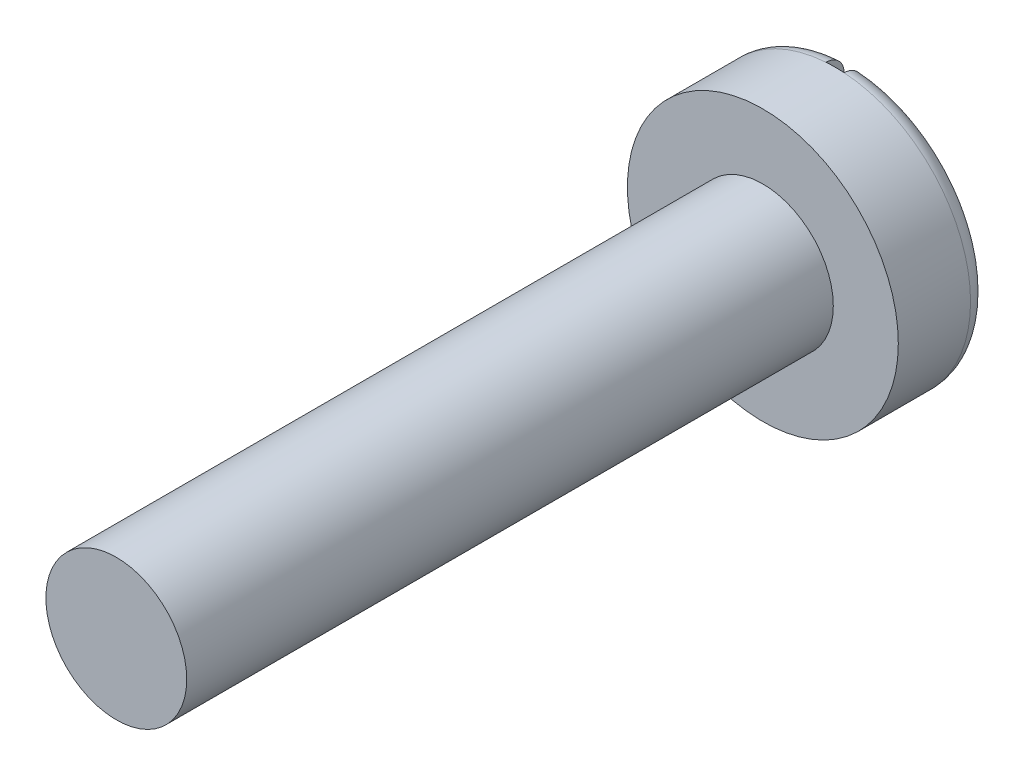
ISO-10303-21;
HEADER;
FILE_DESCRIPTION(('STEP AP214'),'2;1');
FILE_NAME('part.step','',(''),(''),'','','');
FILE_SCHEMA(('AUTOMOTIVE_DESIGN { 1 0 10303 214 1 1 1 1 }'));
ENDSEC;
DATA;
#1=APPLICATION_CONTEXT('core data for automotive mechanical design processes');
#2=APPLICATION_PROTOCOL_DEFINITION('international standard','automotive_design',2000,#1);
#3=PRODUCT_CONTEXT('',#1,'mechanical');
#4=PRODUCT('Part','Part','',(#3));
#5=PRODUCT_RELATED_PRODUCT_CATEGORY('part','',(#4));
#6=PRODUCT_DEFINITION_FORMATION('','',#4);
#7=PRODUCT_DEFINITION_CONTEXT('part definition',#1,'design');
#8=PRODUCT_DEFINITION('design','',#6,#7);
#9=PRODUCT_DEFINITION_SHAPE('','',#8);
#10=(LENGTH_UNIT() NAMED_UNIT(*) SI_UNIT(.MILLI.,.METRE.));
#11=(NAMED_UNIT(*) PLANE_ANGLE_UNIT() SI_UNIT($,.RADIAN.));
#12=(NAMED_UNIT(*) SI_UNIT($,.STERADIAN.) SOLID_ANGLE_UNIT());
#13=UNCERTAINTY_MEASURE_WITH_UNIT(LENGTH_MEASURE(1.E-05),#10,'distance_accuracy_value','');
#14=(GEOMETRIC_REPRESENTATION_CONTEXT(3) GLOBAL_UNCERTAINTY_ASSIGNED_CONTEXT((#13)) GLOBAL_UNIT_ASSIGNED_CONTEXT((#10,
#11,#12)) REPRESENTATION_CONTEXT('',''));
#15=CARTESIAN_POINT('',(0.,0.,0.));
#16=DIRECTION('',(0.,0.,1.));
#17=DIRECTION('',(1.,0.,0.));
#18=AXIS2_PLACEMENT_3D('',#15,#16,#17);
#19=CARTESIAN_POINT('',(0.,0.,55.));
#20=DIRECTION('',(0.,0.,1.));
#21=DIRECTION('',(1.,0.,0.));
#22=AXIS2_PLACEMENT_3D('',#19,#20,#21);
#23=CYLINDRICAL_SURFACE('',#22,1.905);
#24=CARTESIAN_POINT('',(0.,0.,0.));
#25=DIRECTION('',(0.,0.,1.));
#26=DIRECTION('',(1.,0.,0.));
#27=AXIS2_PLACEMENT_3D('',#24,#25,#26);
#28=CIRCLE('',#27,1.905);
#29=CARTESIAN_POINT('',(1.905,0.,0.));
#30=VERTEX_POINT('',#29);
#31=EDGE_CURVE('E104',#30,#30,#28,.T.);
#32=ORIENTED_EDGE('',*,*,#31,.F.);
#33=EDGE_LOOP('',(#32));
#34=FACE_BOUND('',#33,.T.);
#35=CARTESIAN_POINT('',(0.,0.,-1.016));
#36=DIRECTION('',(0.,0.,-1.));
#37=DIRECTION('',(-1.,0.,0.));
#38=AXIS2_PLACEMENT_3D('',#35,#36,#37);
#39=CIRCLE('',#38,1.905);
#40=CARTESIAN_POINT('',(-0.127,1.90076195248116,-1.016));
#41=VERTEX_POINT('',#40);
#42=CARTESIAN_POINT('',(0.127,1.90076195248116,-1.016));
#43=VERTEX_POINT('',#42);
#44=EDGE_CURVE('E83',#41,#43,#39,.T.);
#45=ORIENTED_EDGE('',*,*,#44,.F.);
#46=CARTESIAN_POINT('',(0.,0.,-1.016));
#47=DIRECTION('',(0.,0.,1.));
#48=DIRECTION('',(1.,0.,0.));
#49=AXIS2_PLACEMENT_3D('',#46,#47,#48);
#50=CIRCLE('',#49,1.905);
#51=CARTESIAN_POINT('',(-0.127,-1.90076195248116,-1.016));
#52=VERTEX_POINT('',#51);
#53=EDGE_CURVE('E87',#41,#52,#50,.T.);
#54=ORIENTED_EDGE('',*,*,#53,.T.);
#55=CARTESIAN_POINT('',(0.127,-1.90076195248116,-1.016));
#56=VERTEX_POINT('',#55);
#57=EDGE_CURVE('E86',#56,#52,#39,.T.);
#58=ORIENTED_EDGE('',*,*,#57,.F.);
#59=CARTESIAN_POINT('',(0.,0.,-1.016));
#60=DIRECTION('',(0.,0.,1.));
#61=DIRECTION('',(1.,0.,0.));
#62=AXIS2_PLACEMENT_3D('',#59,#60,#61);
#63=CIRCLE('',#62,1.905);
#64=EDGE_CURVE('E76',#56,#43,#63,.T.);
#65=ORIENTED_EDGE('',*,*,#64,.T.);
#66=EDGE_LOOP('',(#45,#54,#58,#65));
#67=FACE_BOUND('',#66,.T.);
#68=ADVANCED_FACE('F36',(#34,#67),#23,.T.);
#69=CARTESIAN_POINT('',(0.,1.905,-1.27));
#70=DIRECTION('',(0.,0.,1.));
#71=DIRECTION('',(1.,0.,0.));
#72=AXIS2_PLACEMENT_3D('',#69,#70,#71);
#73=PLANE('',#72);
#74=DIRECTION('',(0.,-1.,0.));
#75=VECTOR('',#74,1.);
#76=CARTESIAN_POINT('',(-0.127,0.,-1.27));
#77=LINE('',#76,#75);
#78=CARTESIAN_POINT('',(-0.127,1.6461081373956,-1.27));
#79=VERTEX_POINT('',#78);
#80=CARTESIAN_POINT('',(-0.127,-1.6461081373956,-1.27));
#81=VERTEX_POINT('',#80);
#82=EDGE_CURVE('E99',#79,#81,#77,.T.);
#83=ORIENTED_EDGE('',*,*,#82,.T.);
#84=CARTESIAN_POINT('',(0.,0.,-1.27));
#85=DIRECTION('',(0.,0.,1.));
#86=DIRECTION('',(1.,0.,0.));
#87=AXIS2_PLACEMENT_3D('',#84,#85,#86);
#88=CIRCLE('',#87,1.651);
#89=EDGE_CURVE('E170',#81,#79,#88,.F.);
#90=ORIENTED_EDGE('',*,*,#89,.T.);
#91=EDGE_LOOP('',(#83,#90));
#92=FACE_BOUND('',#91,.T.);
#93=ADVANCED_FACE('F144',(#92),#73,.F.);
#94=CARTESIAN_POINT('',(0.,0.990599999999999,9.0932));
#95=DIRECTION('',(0.,0.,-1.));
#96=DIRECTION('',(-1.,0.,0.));
#97=AXIS2_PLACEMENT_3D('',#94,#95,#96);
#98=PLANE('',#97);
#99=CARTESIAN_POINT('',(0.,0.,9.0932));
#100=DIRECTION('',(0.,0.,1.));
#101=DIRECTION('',(1.,0.,0.));
#102=AXIS2_PLACEMENT_3D('',#99,#100,#101);
#103=CIRCLE('',#102,0.990599999999999);
#104=CARTESIAN_POINT('',(0.990599999999999,0.,9.0932));
#105=VERTEX_POINT('',#104);
#106=EDGE_CURVE('E88',#105,#105,#103,.T.);
#107=ORIENTED_EDGE('',*,*,#106,.T.);
#108=EDGE_LOOP('',(#107));
#109=FACE_BOUND('',#108,.T.);
#110=ADVANCED_FACE('F139',(#109),#98,.F.);
#111=CARTESIAN_POINT('',(0.,0.,55.));
#112=DIRECTION('',(0.,0.,1.));
#113=DIRECTION('',(1.,0.,0.));
#114=AXIS2_PLACEMENT_3D('',#111,#112,#113);
#115=CYLINDRICAL_SURFACE('',#114,0.990599999999999);
#116=ORIENTED_EDGE('',*,*,#106,.F.);
#117=EDGE_LOOP('',(#116));
#118=FACE_BOUND('',#117,.T.);
#119=CARTESIAN_POINT('',(0.,0.,0.));
#120=DIRECTION('',(0.,0.,1.));
#121=DIRECTION('',(1.,0.,0.));
#122=AXIS2_PLACEMENT_3D('',#119,#120,#121);
#123=CIRCLE('',#122,0.9906);
#124=CARTESIAN_POINT('',(0.9906,0.,0.));
#125=VERTEX_POINT('',#124);
#126=EDGE_CURVE('E108',#125,#125,#123,.T.);
#127=ORIENTED_EDGE('',*,*,#126,.T.);
#128=EDGE_LOOP('',(#127));
#129=FACE_BOUND('',#128,.T.);
#130=ADVANCED_FACE('F143',(#118,#129),#115,.T.);
#131=CARTESIAN_POINT('',(0.,1.905,0.));
#132=DIRECTION('',(0.,0.,-1.));
#133=DIRECTION('',(-1.,0.,0.));
#134=AXIS2_PLACEMENT_3D('',#131,#132,#133);
#135=PLANE('',#134);
#136=ORIENTED_EDGE('',*,*,#126,.F.);
#137=EDGE_LOOP('',(#136));
#138=FACE_BOUND('',#137,.T.);
#139=ORIENTED_EDGE('',*,*,#31,.T.);
#140=EDGE_LOOP('',(#139));
#141=FACE_BOUND('',#140,.T.);
#142=ADVANCED_FACE('F148',(#138,#141),#135,.F.);
#143=DIRECTION('',(0.,-1.,0.));
#144=VECTOR('',#143,1.);
#145=CARTESIAN_POINT('',(0.127,0.,-1.27));
#146=LINE('',#145,#144);
#147=CARTESIAN_POINT('',(0.127,1.6461081373956,-1.27));
#148=VERTEX_POINT('',#147);
#149=CARTESIAN_POINT('',(0.127,-1.6461081373956,-1.27));
#150=VERTEX_POINT('',#149);
#151=EDGE_CURVE('E102',#148,#150,#146,.T.);
#152=ORIENTED_EDGE('',*,*,#151,.F.);
#153=CARTESIAN_POINT('',(0.,0.,-1.27));
#154=DIRECTION('',(0.,0.,1.));
#155=DIRECTION('',(1.,0.,0.));
#156=AXIS2_PLACEMENT_3D('',#153,#154,#155);
#157=CIRCLE('',#156,1.651);
#158=EDGE_CURVE('E11',#148,#150,#157,.F.);
#159=ORIENTED_EDGE('',*,*,#158,.T.);
#160=EDGE_LOOP('',(#152,#159));
#161=FACE_BOUND('',#160,.T.);
#162=ADVANCED_FACE('F152',(#161),#73,.F.);
#163=CARTESIAN_POINT('',(-0.127,0.,-1.016));
#164=DIRECTION('',(1.,0.,0.));
#165=DIRECTION('',(0.,0.,-1.));
#166=AXIS2_PLACEMENT_3D('',#163,#164,#165);
#167=PLANE('',#166);
#168=DIRECTION('',(0.,-1.,0.));
#169=VECTOR('',#168,1.);
#170=CARTESIAN_POINT('',(-0.127,0.,-1.016));
#171=LINE('',#170,#169);
#172=EDGE_CURVE('E98',#41,#52,#171,.T.);
#173=ORIENTED_EDGE('',*,*,#172,.T.);
#174=CARTESIAN_POINT('',(-0.127,-1.90076195248116,-1.016));
#175=CARTESIAN_POINT('',(-0.127,-1.90077420548945,-1.03026562544904));
#176=CARTESIAN_POINT('',(-0.127,-1.89955819235538,-1.04452745945829));
#177=CARTESIAN_POINT('',(-0.127,-1.89476024381098,-1.07263564534562));
#178=CARTESIAN_POINT('',(-0.127,-1.8911803027391,-1.08648233717498));
#179=CARTESIAN_POINT('',(-0.127,-1.88174265307725,-1.11338391508229));
#180=CARTESIAN_POINT('',(-0.127,-1.87588389473417,-1.12643843303128));
#181=CARTESIAN_POINT('',(-0.127,-1.86206152779824,-1.15137784491358));
#182=CARTESIAN_POINT('',(-0.127,-1.85409825656604,-1.16326292589299));
#183=CARTESIAN_POINT('',(-0.127,-1.83628495548849,-1.18554061816827));
#184=CARTESIAN_POINT('',(-0.127,-1.82643325024914,-1.19593188974203));
#185=CARTESIAN_POINT('',(-0.127,-1.80512627239349,-1.21491927781837));
#186=CARTESIAN_POINT('',(-0.127,-1.79367068432199,-1.22351504034549));
#187=CARTESIAN_POINT('',(-0.127,-1.76945591831009,-1.23868610901529));
#188=CARTESIAN_POINT('',(-0.127,-1.75669376785118,-1.24525666520417));
#189=CARTESIAN_POINT('',(-0.127,-1.73025169416702,-1.25616474263574));
#190=CARTESIAN_POINT('',(-0.127,-1.71657227312367,-1.26050347464249));
#191=CARTESIAN_POINT('',(-0.127,-1.69336214721708,-1.26577196168292));
#192=CARTESIAN_POINT('',(-0.127,-1.68397479147604,-1.26735660834129));
#193=CARTESIAN_POINT('',(-0.127,-1.66509560553012,-1.26947050304372));
#194=CARTESIAN_POINT('',(-0.127,-1.65560394382737,-1.27000125632662));
#195=CARTESIAN_POINT('',(-0.127,-1.6461081373959,-1.27000000000135));
#196=B_SPLINE_CURVE_WITH_KNOTS('',3,(#174,#175,#176,#177,#178,#179,#180,#181,#182,#183,#184,
#185,#186,#187,#188,#189,#190,#191,#192,#193,#194,#195),.UNSPECIFIED.,.F.,.F.,(4,2,2,2,2,2,2,2,
2,2,4),(0.,0.0427396779473607,0.0854433443623842,0.128166705862062,0.170883222809471,
0.213637814178934,0.25640082645913,0.29926338575801,0.34210266754061,0.370607921996298,
0.399072434030781),.UNSPECIFIED.);
#197=EDGE_CURVE('E124',#52,#81,#196,.T.);
#198=ORIENTED_EDGE('',*,*,#197,.T.);
#199=ORIENTED_EDGE('',*,*,#82,.F.);
#200=CARTESIAN_POINT('',(-0.127,1.6461081373956,-1.27));
#201=CARTESIAN_POINT('',(-0.127,1.66046341408676,-1.27001205642489));
#202=CARTESIAN_POINT('',(-0.127,1.67481546470729,-1.26879093943889));
#203=CARTESIAN_POINT('',(-0.127,1.70310455931541,-1.26396971764651));
#204=CARTESIAN_POINT('',(-0.127,1.71704188260949,-1.2603712536276));
#205=CARTESIAN_POINT('',(-0.127,1.744120971695,-1.2508799840151));
#206=CARTESIAN_POINT('',(-0.127,1.75726231576698,-1.24498597428955));
#207=CARTESIAN_POINT('',(-0.127,1.7823643372761,-1.2310738476685));
#208=CARTESIAN_POINT('',(-0.127,1.79432525769879,-1.22305616917889));
#209=CARTESIAN_POINT('',(-0.127,1.81670868297419,-1.20513560615357));
#210=CARTESIAN_POINT('',(-0.127,1.82713360275823,-1.19523573820479));
#211=CARTESIAN_POINT('',(-0.127,1.84617058490362,-1.17382011565835));
#212=CARTESIAN_POINT('',(-0.127,1.85478229752695,-1.16230405003517));
#213=CARTESIAN_POINT('',(-0.127,1.86992466463746,-1.13801430359242));
#214=CARTESIAN_POINT('',(-0.127,1.87645998322132,-1.12524352693912));
#215=CARTESIAN_POINT('',(-0.127,1.88728551816203,-1.09878723281334));
#216=CARTESIAN_POINT('',(-0.127,1.89157712406936,-1.08510228743056));
#217=CARTESIAN_POINT('',(-0.127,1.89670535788062,-1.06210858317353));
#218=CARTESIAN_POINT('',(-0.127,1.89822567537391,-1.0529465243326));
#219=CARTESIAN_POINT('',(-0.127,1.90025381604283,-1.03452427938172));
#220=CARTESIAN_POINT('',(-0.127,1.90076308020771,-1.0252642518646));
#221=CARTESIAN_POINT('',(-0.127,1.90076195248226,-1.01600000000025));
#222=B_SPLINE_CURVE_WITH_KNOTS('',3,(#200,#201,#202,#203,#204,#205,#206,#207,#208,#209,#210,
#211,#212,#213,#214,#215,#216,#217,#218,#219,#220,#221),.UNSPECIFIED.,.F.,.F.,(4,2,2,2,2,2,2,2,
2,2,4),(0.,0.043009408963126,0.0859891648386896,0.128991496240446,0.171984957237337,
0.214910084736852,0.25784348422209,0.300679751406985,0.343489458204936,0.371299661848379,
0.399070200861597),.UNSPECIFIED.);
#223=EDGE_CURVE('E117',#79,#41,#222,.T.);
#224=ORIENTED_EDGE('',*,*,#223,.T.);
#225=EDGE_LOOP('',(#173,#198,#199,#224));
#226=FACE_BOUND('',#225,.T.);
#227=ADVANCED_FACE('F130',(#226),#167,.T.);
#228=CARTESIAN_POINT('',(0.127,0.,-1.016));
#229=DIRECTION('',(1.,0.,0.));
#230=DIRECTION('',(0.,0.,-1.));
#231=AXIS2_PLACEMENT_3D('',#228,#229,#230);
#232=PLANE('',#231);
#233=DIRECTION('',(0.,-1.,0.));
#234=VECTOR('',#233,1.);
#235=CARTESIAN_POINT('',(0.127,0.,-1.016));
#236=LINE('',#235,#234);
#237=EDGE_CURVE('E91',#43,#56,#236,.T.);
#238=ORIENTED_EDGE('',*,*,#237,.F.);
#239=CARTESIAN_POINT('',(0.127,1.90076195248116,-1.016));
#240=CARTESIAN_POINT('',(0.127,1.90077420548945,-1.03026562544904));
#241=CARTESIAN_POINT('',(0.127,1.89955819235538,-1.04452745945829));
#242=CARTESIAN_POINT('',(0.127,1.89476024381098,-1.07263564534562));
#243=CARTESIAN_POINT('',(0.127,1.8911803027391,-1.08648233717498));
#244=CARTESIAN_POINT('',(0.127,1.88174265307725,-1.11338391508229));
#245=CARTESIAN_POINT('',(0.127,1.87588389473417,-1.12643843303128));
#246=CARTESIAN_POINT('',(0.127,1.86206152779824,-1.15137784491358));
#247=CARTESIAN_POINT('',(0.127,1.85409825656604,-1.16326292589299));
#248=CARTESIAN_POINT('',(0.127,1.83628495548849,-1.18554061816827));
#249=CARTESIAN_POINT('',(0.127,1.82643325024914,-1.19593188974203));
#250=CARTESIAN_POINT('',(0.127,1.80512627239349,-1.21491927781837));
#251=CARTESIAN_POINT('',(0.127,1.79367068432199,-1.22351504034549));
#252=CARTESIAN_POINT('',(0.127,1.76945591831009,-1.23868610901529));
#253=CARTESIAN_POINT('',(0.127,1.75669376785118,-1.24525666520417));
#254=CARTESIAN_POINT('',(0.127,1.73025169416702,-1.25616474263574));
#255=CARTESIAN_POINT('',(0.127,1.71657227312367,-1.26050347464249));
#256=CARTESIAN_POINT('',(0.127,1.69336214721708,-1.26577196168292));
#257=CARTESIAN_POINT('',(0.127,1.68397479147604,-1.26735660834129));
#258=CARTESIAN_POINT('',(0.127,1.66509560553012,-1.26947050304372));
#259=CARTESIAN_POINT('',(0.127,1.65560394382737,-1.27000125632662));
#260=CARTESIAN_POINT('',(0.127,1.6461081373959,-1.27000000000135));
#261=B_SPLINE_CURVE_WITH_KNOTS('',3,(#239,#240,#241,#242,#243,#244,#245,#246,#247,#248,#249,
#250,#251,#252,#253,#254,#255,#256,#257,#258,#259,#260),.UNSPECIFIED.,.F.,.F.,(4,2,2,2,2,2,2,2,
2,2,4),(0.,0.0427396779473607,0.0854433443623842,0.128166705862062,0.170883222809471,
0.213637814178934,0.25640082645913,0.29926338575801,0.34210266754061,0.370607921996298,
0.399072434030781),.UNSPECIFIED.);
#262=EDGE_CURVE('E45',#43,#148,#261,.T.);
#263=ORIENTED_EDGE('',*,*,#262,.T.);
#264=ORIENTED_EDGE('',*,*,#151,.T.);
#265=CARTESIAN_POINT('',(0.127,-1.6461081373956,-1.27));
#266=CARTESIAN_POINT('',(0.127,-1.66046341408676,-1.27001205642489));
#267=CARTESIAN_POINT('',(0.127,-1.67481546470729,-1.26879093943889));
#268=CARTESIAN_POINT('',(0.127,-1.70310455931541,-1.26396971764651));
#269=CARTESIAN_POINT('',(0.127,-1.71704188260949,-1.2603712536276));
#270=CARTESIAN_POINT('',(0.127,-1.744120971695,-1.2508799840151));
#271=CARTESIAN_POINT('',(0.127,-1.75726231576698,-1.24498597428955));
#272=CARTESIAN_POINT('',(0.127,-1.7823643372761,-1.2310738476685));
#273=CARTESIAN_POINT('',(0.127,-1.79432525769879,-1.22305616917889));
#274=CARTESIAN_POINT('',(0.127,-1.81670868297419,-1.20513560615357));
#275=CARTESIAN_POINT('',(0.127,-1.82713360275823,-1.19523573820479));
#276=CARTESIAN_POINT('',(0.127,-1.84617058490362,-1.17382011565835));
#277=CARTESIAN_POINT('',(0.127,-1.85478229752695,-1.16230405003517));
#278=CARTESIAN_POINT('',(0.127,-1.86992466463746,-1.13801430359242));
#279=CARTESIAN_POINT('',(0.127,-1.87645998322132,-1.12524352693912));
#280=CARTESIAN_POINT('',(0.127,-1.88728551816203,-1.09878723281334));
#281=CARTESIAN_POINT('',(0.127,-1.89157712406936,-1.08510228743056));
#282=CARTESIAN_POINT('',(0.127,-1.89670535788062,-1.06210858317353));
#283=CARTESIAN_POINT('',(0.127,-1.89822567537391,-1.0529465243326));
#284=CARTESIAN_POINT('',(0.127,-1.90025381604283,-1.03452427938172));
#285=CARTESIAN_POINT('',(0.127,-1.90076308020771,-1.0252642518646));
#286=CARTESIAN_POINT('',(0.127,-1.90076195248226,-1.01600000000025));
#287=B_SPLINE_CURVE_WITH_KNOTS('',3,(#265,#266,#267,#268,#269,#270,#271,#272,#273,#274,#275,
#276,#277,#278,#279,#280,#281,#282,#283,#284,#285,#286),.UNSPECIFIED.,.F.,.F.,(4,2,2,2,2,2,2,2,
2,2,4),(0.,0.043009408963126,0.0859891648386896,0.128991496240446,0.171984957237337,
0.214910084736852,0.25784348422209,0.300679751406985,0.343489458204936,0.371299661848379,
0.399070200861597),.UNSPECIFIED.);
#288=EDGE_CURVE('E77',#150,#56,#287,.T.);
#289=ORIENTED_EDGE('',*,*,#288,.T.);
#290=EDGE_LOOP('',(#238,#263,#264,#289));
#291=FACE_BOUND('',#290,.T.);
#292=ADVANCED_FACE('F92',(#291),#232,.F.);
#293=CARTESIAN_POINT('',(0.,0.,-1.016));
#294=DIRECTION('',(0.,0.,-1.));
#295=DIRECTION('',(-1.,0.,0.));
#296=AXIS2_PLACEMENT_3D('',#293,#294,#295);
#297=PLANE('',#296);
#298=ORIENTED_EDGE('',*,*,#44,.T.);
#299=ORIENTED_EDGE('',*,*,#237,.T.);
#300=ORIENTED_EDGE('',*,*,#57,.T.);
#301=ORIENTED_EDGE('',*,*,#172,.F.);
#302=EDGE_LOOP('',(#298,#299,#300,#301));
#303=FACE_BOUND('',#302,.T.);
#304=ADVANCED_FACE('F96',(#303),#297,.T.);
#305=CARTESIAN_POINT('',(0.,0.,-1.016));
#306=DIRECTION('',(0.,0.,1.));
#307=DIRECTION('',(1.,0.,0.));
#308=AXIS2_PLACEMENT_3D('',#305,#306,#307);
#309=TOROIDAL_SURFACE('',#308,1.651,0.254);
#310=ORIENTED_EDGE('',*,*,#223,.F.);
#311=ORIENTED_EDGE('',*,*,#89,.F.);
#312=ORIENTED_EDGE('',*,*,#197,.F.);
#313=ORIENTED_EDGE('',*,*,#53,.F.);
#314=EDGE_LOOP('',(#310,#311,#312,#313));
#315=FACE_BOUND('',#314,.T.);
#316=ADVANCED_FACE('F134',(#315),#309,.T.);
#317=CARTESIAN_POINT('',(0.,0.,-1.016));
#318=DIRECTION('',(0.,0.,1.));
#319=DIRECTION('',(1.,0.,0.));
#320=AXIS2_PLACEMENT_3D('',#317,#318,#319);
#321=TOROIDAL_SURFACE('',#320,1.651,0.254);
#322=ORIENTED_EDGE('',*,*,#288,.F.);
#323=ORIENTED_EDGE('',*,*,#158,.F.);
#324=ORIENTED_EDGE('',*,*,#262,.F.);
#325=ORIENTED_EDGE('',*,*,#64,.F.);
#326=EDGE_LOOP('',(#322,#323,#324,#325));
#327=FACE_BOUND('',#326,.T.);
#328=ADVANCED_FACE('F38',(#327),#321,.T.);
#329=CLOSED_SHELL('',(#68,#93,#110,#130,#142,#162,#227,#292,#304,#316,#328));
#330=MANIFOLD_SOLID_BREP('B2',#329);
#331=ADVANCED_BREP_SHAPE_REPRESENTATION('',(#18,#330),#14);
#332=SHAPE_DEFINITION_REPRESENTATION(#9,#331);
ENDSEC;
END-ISO-10303-21;
